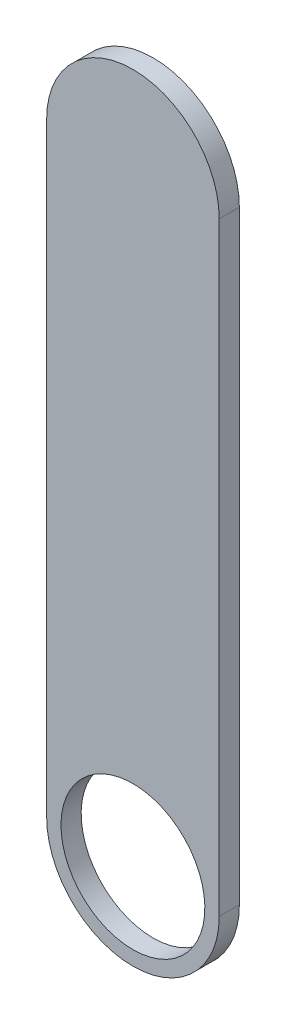
ISO-10303-21;
HEADER;
FILE_DESCRIPTION(('STEP AP214'),'2;1');
FILE_NAME('part.step','',(''),(''),'','','');
FILE_SCHEMA(('AUTOMOTIVE_DESIGN { 1 0 10303 214 1 1 1 1 }'));
ENDSEC;
DATA;
#1=APPLICATION_CONTEXT('core data for automotive mechanical design processes');
#2=APPLICATION_PROTOCOL_DEFINITION('international standard','automotive_design',2000,#1);
#3=PRODUCT_CONTEXT('',#1,'mechanical');
#4=PRODUCT('Part','Part','',(#3));
#5=PRODUCT_RELATED_PRODUCT_CATEGORY('part','',(#4));
#6=PRODUCT_DEFINITION_FORMATION('','',#4);
#7=PRODUCT_DEFINITION_CONTEXT('part definition',#1,'design');
#8=PRODUCT_DEFINITION('design','',#6,#7);
#9=PRODUCT_DEFINITION_SHAPE('','',#8);
#10=(LENGTH_UNIT() NAMED_UNIT(*) SI_UNIT(.MILLI.,.METRE.));
#11=(NAMED_UNIT(*) PLANE_ANGLE_UNIT() SI_UNIT($,.RADIAN.));
#12=(NAMED_UNIT(*) SI_UNIT($,.STERADIAN.) SOLID_ANGLE_UNIT());
#13=UNCERTAINTY_MEASURE_WITH_UNIT(LENGTH_MEASURE(1.E-05),#10,'distance_accuracy_value','');
#14=(GEOMETRIC_REPRESENTATION_CONTEXT(3) GLOBAL_UNCERTAINTY_ASSIGNED_CONTEXT((#13)) GLOBAL_UNIT_ASSIGNED_CONTEXT((#10,
#11,#12)) REPRESENTATION_CONTEXT('',''));
#15=CARTESIAN_POINT('',(0.,0.,0.));
#16=DIRECTION('',(0.,0.,1.));
#17=DIRECTION('',(1.,0.,0.));
#18=AXIS2_PLACEMENT_3D('',#15,#16,#17);
#19=CARTESIAN_POINT('',(89.56,-77.54,-0.045));
#20=DIRECTION('',(0.,0.,-1.));
#21=DIRECTION('',(0.,-1.,0.));
#22=AXIS2_PLACEMENT_3D('',#19,#20,#21);
#23=CYLINDRICAL_SURFACE('',#22,0.125);
#24=CARTESIAN_POINT('',(89.56,-77.54,1.6));
#25=DIRECTION('',(0.,0.,-1.));
#26=DIRECTION('',(0.,-1.,0.));
#27=AXIS2_PLACEMENT_3D('',#24,#25,#26);
#28=CIRCLE('',#27,0.125);
#29=CARTESIAN_POINT('',(89.56,-77.665,1.6));
#30=VERTEX_POINT('',#29);
#31=EDGE_CURVE('E88',#30,#30,#28,.T.);
#32=ORIENTED_EDGE('',*,*,#31,.T.);
#33=DIRECTION('',(0.,0.,1.));
#34=VECTOR('',#33,1.);
#35=CARTESIAN_POINT('',(89.56,-77.665,-0.045));
#36=LINE('',#35,#34);
#37=CARTESIAN_POINT('',(89.56,-77.665,1.635));
#38=VERTEX_POINT('',#37);
#39=EDGE_CURVE('E11',#30,#38,#36,.T.);
#40=ORIENTED_EDGE('',*,*,#39,.T.);
#41=CARTESIAN_POINT('',(89.56,-77.54,1.635));
#42=DIRECTION('',(0.,0.,-1.));
#43=DIRECTION('',(0.,-1.,0.));
#44=AXIS2_PLACEMENT_3D('',#41,#42,#43);
#45=CIRCLE('',#44,0.125);
#46=EDGE_CURVE('E27',#38,#38,#45,.T.);
#47=ORIENTED_EDGE('',*,*,#46,.F.);
#48=ORIENTED_EDGE('',*,*,#39,.F.);
#49=EDGE_LOOP('',(#32,#40,#47,#48));
#50=FACE_BOUND('',#49,.T.);
#51=ADVANCED_FACE('F17',(#50),#23,.F.);
#52=CARTESIAN_POINT('',(89.71,-77.54,1.6));
#53=DIRECTION('',(-1.,0.,0.));
#54=DIRECTION('',(0.,0.,1.));
#55=AXIS2_PLACEMENT_3D('',#52,#53,#54);
#56=PLANE('',#55);
#57=DIRECTION('',(0.,1.,0.));
#58=VECTOR('',#57,1.);
#59=CARTESIAN_POINT('',(89.71,-77.54,1.6));
#60=LINE('',#59,#58);
#61=CARTESIAN_POINT('',(89.71,-77.54,1.6));
#62=VERTEX_POINT('',#61);
#63=CARTESIAN_POINT('',(89.71,-76.49,1.6));
#64=VERTEX_POINT('',#63);
#65=EDGE_CURVE('E20',#62,#64,#60,.T.);
#66=ORIENTED_EDGE('',*,*,#65,.T.);
#67=DIRECTION('',(0.,0.,1.));
#68=VECTOR('',#67,1.);
#69=CARTESIAN_POINT('',(89.71,-76.49,1.6));
#70=LINE('',#69,#68);
#71=CARTESIAN_POINT('',(89.71,-76.49,1.635));
#72=VERTEX_POINT('',#71);
#73=EDGE_CURVE('E84',#64,#72,#70,.T.);
#74=ORIENTED_EDGE('',*,*,#73,.T.);
#75=DIRECTION('',(0.,1.,0.));
#76=VECTOR('',#75,1.);
#77=CARTESIAN_POINT('',(89.71,-77.54,1.635));
#78=LINE('',#77,#76);
#79=CARTESIAN_POINT('',(89.71,-77.54,1.635));
#80=VERTEX_POINT('',#79);
#81=EDGE_CURVE('E77',#80,#72,#78,.T.);
#82=ORIENTED_EDGE('',*,*,#81,.F.);
#83=DIRECTION('',(0.,0.,1.));
#84=VECTOR('',#83,1.);
#85=CARTESIAN_POINT('',(89.71,-77.54,1.6));
#86=LINE('',#85,#84);
#87=EDGE_CURVE('E81',#62,#80,#86,.T.);
#88=ORIENTED_EDGE('',*,*,#87,.F.);
#89=EDGE_LOOP('',(#66,#74,#82,#88));
#90=FACE_BOUND('',#89,.T.);
#91=ADVANCED_FACE('F79',(#90),#56,.F.);
#92=CARTESIAN_POINT('',(89.41,-76.49,1.635));
#93=DIRECTION('',(0.,0.,1.));
#94=DIRECTION('',(1.,0.,0.));
#95=AXIS2_PLACEMENT_3D('',#92,#93,#94);
#96=PLANE('',#95);
#97=ORIENTED_EDGE('',*,*,#46,.T.);
#98=EDGE_LOOP('',(#97));
#99=FACE_BOUND('',#98,.T.);
#100=DIRECTION('',(0.,-1.,0.));
#101=VECTOR('',#100,1.);
#102=CARTESIAN_POINT('',(89.41,-76.49,1.635));
#103=LINE('',#102,#101);
#104=CARTESIAN_POINT('',(89.41,-76.49,1.635));
#105=VERTEX_POINT('',#104);
#106=CARTESIAN_POINT('',(89.41,-77.54,1.635));
#107=VERTEX_POINT('',#106);
#108=EDGE_CURVE('E94',#105,#107,#103,.T.);
#109=ORIENTED_EDGE('',*,*,#108,.T.);
#110=CARTESIAN_POINT('',(89.56,-77.54,1.635));
#111=DIRECTION('',(0.,0.,1.));
#112=DIRECTION('',(-1.,0.,0.));
#113=AXIS2_PLACEMENT_3D('',#110,#111,#112);
#114=CIRCLE('',#113,0.15);
#115=EDGE_CURVE('E91',#107,#80,#114,.T.);
#116=ORIENTED_EDGE('',*,*,#115,.T.);
#117=ORIENTED_EDGE('',*,*,#81,.T.);
#118=CARTESIAN_POINT('',(89.56,-76.49,1.635));
#119=DIRECTION('',(0.,0.,1.));
#120=DIRECTION('',(1.,0.,0.));
#121=AXIS2_PLACEMENT_3D('',#118,#119,#120);
#122=CIRCLE('',#121,0.15);
#123=EDGE_CURVE('E109',#72,#105,#122,.T.);
#124=ORIENTED_EDGE('',*,*,#123,.T.);
#125=EDGE_LOOP('',(#109,#116,#117,#124));
#126=FACE_BOUND('',#125,.T.);
#127=ADVANCED_FACE('F92',(#99,#126),#96,.T.);
#128=CARTESIAN_POINT('',(89.41,-76.49,1.6));
#129=DIRECTION('',(0.,0.,1.));
#130=DIRECTION('',(1.,0.,0.));
#131=AXIS2_PLACEMENT_3D('',#128,#129,#130);
#132=PLANE('',#131);
#133=ORIENTED_EDGE('',*,*,#31,.F.);
#134=EDGE_LOOP('',(#133));
#135=FACE_BOUND('',#134,.T.);
#136=CARTESIAN_POINT('',(89.56,-76.49,1.6));
#137=DIRECTION('',(0.,0.,1.));
#138=DIRECTION('',(1.,0.,0.));
#139=AXIS2_PLACEMENT_3D('',#136,#137,#138);
#140=CIRCLE('',#139,0.15);
#141=CARTESIAN_POINT('',(89.41,-76.49,1.6));
#142=VERTEX_POINT('',#141);
#143=EDGE_CURVE('E111',#64,#142,#140,.T.);
#144=ORIENTED_EDGE('',*,*,#143,.F.);
#145=ORIENTED_EDGE('',*,*,#65,.F.);
#146=CARTESIAN_POINT('',(89.56,-77.54,1.6));
#147=DIRECTION('',(0.,0.,1.));
#148=DIRECTION('',(-1.,0.,0.));
#149=AXIS2_PLACEMENT_3D('',#146,#147,#148);
#150=CIRCLE('',#149,0.15);
#151=CARTESIAN_POINT('',(89.41,-77.54,1.6));
#152=VERTEX_POINT('',#151);
#153=EDGE_CURVE('E100',#152,#62,#150,.T.);
#154=ORIENTED_EDGE('',*,*,#153,.F.);
#155=DIRECTION('',(0.,-1.,0.));
#156=VECTOR('',#155,1.);
#157=CARTESIAN_POINT('',(89.41,-76.49,1.6));
#158=LINE('',#157,#156);
#159=EDGE_CURVE('E131',#142,#152,#158,.T.);
#160=ORIENTED_EDGE('',*,*,#159,.F.);
#161=EDGE_LOOP('',(#144,#145,#154,#160));
#162=FACE_BOUND('',#161,.T.);
#163=ADVANCED_FACE('F140',(#135,#162),#132,.F.);
#164=CARTESIAN_POINT('',(89.56,-77.54,1.6));
#165=DIRECTION('',(0.,0.,-1.));
#166=DIRECTION('',(-1.,0.,0.));
#167=AXIS2_PLACEMENT_3D('',#164,#165,#166);
#168=CYLINDRICAL_SURFACE('',#167,0.15);
#169=ORIENTED_EDGE('',*,*,#153,.T.);
#170=ORIENTED_EDGE('',*,*,#87,.T.);
#171=ORIENTED_EDGE('',*,*,#115,.F.);
#172=DIRECTION('',(0.,0.,1.));
#173=VECTOR('',#172,1.);
#174=CARTESIAN_POINT('',(89.41,-77.54,1.6));
#175=LINE('',#174,#173);
#176=EDGE_CURVE('E128',#152,#107,#175,.T.);
#177=ORIENTED_EDGE('',*,*,#176,.F.);
#178=EDGE_LOOP('',(#169,#170,#171,#177));
#179=FACE_BOUND('',#178,.T.);
#180=ADVANCED_FACE('F99',(#179),#168,.T.);
#181=CARTESIAN_POINT('',(89.56,-76.49,1.6));
#182=DIRECTION('',(0.,0.,-1.));
#183=DIRECTION('',(1.,0.,0.));
#184=AXIS2_PLACEMENT_3D('',#181,#182,#183);
#185=CYLINDRICAL_SURFACE('',#184,0.15);
#186=ORIENTED_EDGE('',*,*,#143,.T.);
#187=DIRECTION('',(0.,0.,1.));
#188=VECTOR('',#187,1.);
#189=CARTESIAN_POINT('',(89.41,-76.49,1.6));
#190=LINE('',#189,#188);
#191=EDGE_CURVE('E120',#142,#105,#190,.T.);
#192=ORIENTED_EDGE('',*,*,#191,.T.);
#193=ORIENTED_EDGE('',*,*,#123,.F.);
#194=ORIENTED_EDGE('',*,*,#73,.F.);
#195=EDGE_LOOP('',(#186,#192,#193,#194));
#196=FACE_BOUND('',#195,.T.);
#197=ADVANCED_FACE('F144',(#196),#185,.T.);
#198=CARTESIAN_POINT('',(89.41,-76.49,1.6));
#199=DIRECTION('',(1.,0.,0.));
#200=DIRECTION('',(0.,1.,0.));
#201=AXIS2_PLACEMENT_3D('',#198,#199,#200);
#202=PLANE('',#201);
#203=ORIENTED_EDGE('',*,*,#159,.T.);
#204=ORIENTED_EDGE('',*,*,#176,.T.);
#205=ORIENTED_EDGE('',*,*,#108,.F.);
#206=ORIENTED_EDGE('',*,*,#191,.F.);
#207=EDGE_LOOP('',(#203,#204,#205,#206));
#208=FACE_BOUND('',#207,.T.);
#209=ADVANCED_FACE('F139',(#208),#202,.F.);
#210=CLOSED_SHELL('',(#51,#91,#127,#163,#180,#197,#209));
#211=MANIFOLD_SOLID_BREP('B1',#210);
#212=ADVANCED_BREP_SHAPE_REPRESENTATION('',(#18,#211),#14);
#213=SHAPE_DEFINITION_REPRESENTATION(#9,#212);
ENDSEC;
END-ISO-10303-21;
